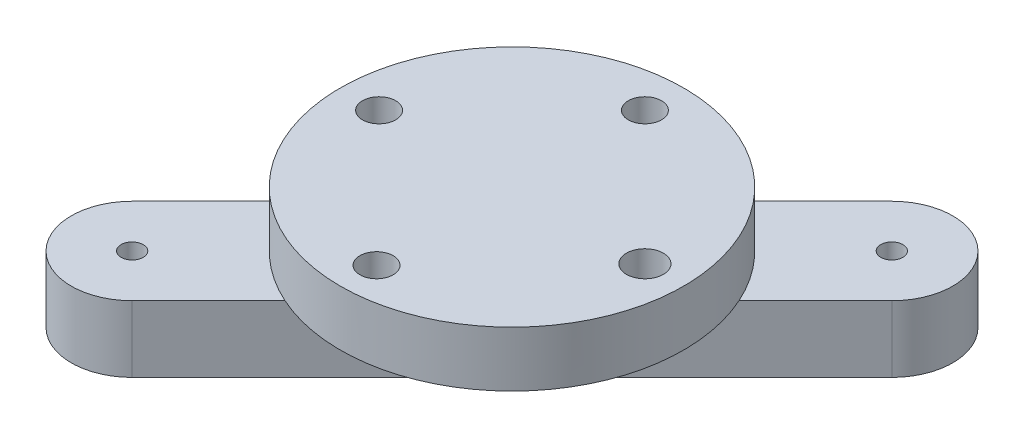
ISO-10303-21;
HEADER;
FILE_DESCRIPTION(('STEP AP214'),'2;1');
FILE_NAME('part.step','',(''),(''),'','','');
FILE_SCHEMA(('AUTOMOTIVE_DESIGN { 1 0 10303 214 1 1 1 1 }'));
ENDSEC;
DATA;
#1=APPLICATION_CONTEXT('core data for automotive mechanical design processes');
#2=APPLICATION_PROTOCOL_DEFINITION('international standard','automotive_design',2000,#1);
#3=PRODUCT_CONTEXT('',#1,'mechanical');
#4=PRODUCT('Part','Part','',(#3));
#5=PRODUCT_RELATED_PRODUCT_CATEGORY('part','',(#4));
#6=PRODUCT_DEFINITION_FORMATION('','',#4);
#7=PRODUCT_DEFINITION_CONTEXT('part definition',#1,'design');
#8=PRODUCT_DEFINITION('design','',#6,#7);
#9=PRODUCT_DEFINITION_SHAPE('','',#8);
#10=(LENGTH_UNIT() NAMED_UNIT(*) SI_UNIT(.MILLI.,.METRE.));
#11=(NAMED_UNIT(*) PLANE_ANGLE_UNIT() SI_UNIT($,.RADIAN.));
#12=(NAMED_UNIT(*) SI_UNIT($,.STERADIAN.) SOLID_ANGLE_UNIT());
#13=UNCERTAINTY_MEASURE_WITH_UNIT(LENGTH_MEASURE(1.E-05),#10,'distance_accuracy_value','');
#14=(GEOMETRIC_REPRESENTATION_CONTEXT(3) GLOBAL_UNCERTAINTY_ASSIGNED_CONTEXT((#13)) GLOBAL_UNIT_ASSIGNED_CONTEXT((#10,
#11,#12)) REPRESENTATION_CONTEXT('',''));
#15=CARTESIAN_POINT('',(0.,0.,0.));
#16=DIRECTION('',(0.,0.,1.));
#17=DIRECTION('',(1.,0.,0.));
#18=AXIS2_PLACEMENT_3D('',#15,#16,#17);
#19=CARTESIAN_POINT('',(0.,0.,0.));
#20=DIRECTION('',(0.,1.,0.));
#21=DIRECTION('',(0.,0.,1.));
#22=AXIS2_PLACEMENT_3D('',#19,#20,#21);
#23=PLANE('',#22);
#24=CARTESIAN_POINT('',(0.,0.,24.));
#25=DIRECTION('',(0.,1.,0.));
#26=DIRECTION('',(0.,0.,1.));
#27=AXIS2_PLACEMENT_3D('',#24,#25,#26);
#28=CIRCLE('',#27,5.);
#29=CARTESIAN_POINT('',(0.,0.,29.));
#30=VERTEX_POINT('',#29);
#31=EDGE_CURVE('E192',#30,#30,#28,.T.);
#32=ORIENTED_EDGE('',*,*,#31,.T.);
#33=EDGE_LOOP('',(#32));
#34=FACE_BOUND('',#33,.T.);
#35=CARTESIAN_POINT('',(24.,0.,0.));
#36=DIRECTION('',(0.,1.,0.));
#37=DIRECTION('',(0.,0.,1.));
#38=AXIS2_PLACEMENT_3D('',#35,#36,#37);
#39=CIRCLE('',#38,5.);
#40=CARTESIAN_POINT('',(24.,0.,5.));
#41=VERTEX_POINT('',#40);
#42=EDGE_CURVE('E184',#41,#41,#39,.T.);
#43=ORIENTED_EDGE('',*,*,#42,.T.);
#44=EDGE_LOOP('',(#43));
#45=FACE_BOUND('',#44,.T.);
#46=CARTESIAN_POINT('',(0.,0.,0.));
#47=DIRECTION('',(0.,1.,0.));
#48=DIRECTION('',(0.,0.,1.));
#49=AXIS2_PLACEMENT_3D('',#46,#47,#48);
#50=CIRCLE('',#49,31.);
#51=CARTESIAN_POINT('',(-12.7157269388672,0.,28.2720761249712));
#52=VERTEX_POINT('',#51);
#53=CARTESIAN_POINT('',(28.2720761249712,0.,-12.7157269388672));
#54=VERTEX_POINT('',#53);
#55=EDGE_CURVE('E204',#52,#54,#50,.T.);
#56=ORIENTED_EDGE('',*,*,#55,.F.);
#57=DIRECTION('',(0.707106781186547,0.,-0.707106781186548));
#58=VECTOR('',#57,1.);
#59=CARTESIAN_POINT('',(-26.5165042944955,0.,42.0728534805996));
#60=LINE('',#59,#58);
#61=EDGE_CURVE('E11',#52,#54,#60,.T.);
#62=ORIENTED_EDGE('',*,*,#61,.T.);
#63=EDGE_LOOP('',(#56,#62));
#64=FACE_BOUND('',#63,.T.);
#65=ADVANCED_FACE('F45',(#34,#45,#64),#23,.F.);
#66=CARTESIAN_POINT('',(0.,10.,0.));
#67=DIRECTION('',(0.,-1.,0.));
#68=DIRECTION('',(0.,0.,-1.));
#69=AXIS2_PLACEMENT_3D('',#66,#67,#68);
#70=CYLINDRICAL_SURFACE('',#69,31.);
#71=CARTESIAN_POINT('',(0.,10.,0.));
#72=DIRECTION('',(0.,1.,0.));
#73=DIRECTION('',(0.,0.,1.));
#74=AXIS2_PLACEMENT_3D('',#71,#72,#73);
#75=CIRCLE('',#74,31.);
#76=CARTESIAN_POINT('',(0.,10.,31.));
#77=VERTEX_POINT('',#76);
#78=EDGE_CURVE('E208',#77,#77,#75,.T.);
#79=ORIENTED_EDGE('',*,*,#78,.F.);
#80=EDGE_LOOP('',(#79));
#81=FACE_BOUND('',#80,.T.);
#82=CARTESIAN_POINT('',(12.7157269388672,0.,-28.2720761249712));
#83=VERTEX_POINT('',#82);
#84=EDGE_CURVE('E212',#54,#83,#50,.T.);
#85=ORIENTED_EDGE('',*,*,#84,.T.);
#86=CARTESIAN_POINT('',(-28.2720761249712,0.,12.7157269388672));
#87=VERTEX_POINT('',#86);
#88=EDGE_CURVE('E216',#83,#87,#50,.T.);
#89=ORIENTED_EDGE('',*,*,#88,.T.);
#90=EDGE_CURVE('E257',#87,#52,#50,.T.);
#91=ORIENTED_EDGE('',*,*,#90,.T.);
#92=ORIENTED_EDGE('',*,*,#55,.T.);
#93=EDGE_LOOP('',(#85,#89,#91,#92));
#94=FACE_BOUND('',#93,.T.);
#95=ADVANCED_FACE('F47',(#81,#94),#70,.T.);
#96=CARTESIAN_POINT('',(0.,10.,0.));
#97=DIRECTION('',(0.,1.,0.));
#98=DIRECTION('',(0.,0.,1.));
#99=AXIS2_PLACEMENT_3D('',#96,#97,#98);
#100=PLANE('',#99);
#101=CARTESIAN_POINT('',(0.,10.,24.4602652919777));
#102=DIRECTION('',(0.,1.,0.));
#103=DIRECTION('',(0.,0.,1.));
#104=AXIS2_PLACEMENT_3D('',#101,#102,#103);
#105=CIRCLE('',#104,3.);
#106=CARTESIAN_POINT('',(0.,10.,27.4602652919777));
#107=VERTEX_POINT('',#106);
#108=EDGE_CURVE('E159',#107,#107,#105,.T.);
#109=ORIENTED_EDGE('',*,*,#108,.F.);
#110=EDGE_LOOP('',(#109));
#111=FACE_BOUND('',#110,.T.);
#112=CARTESIAN_POINT('',(-24.,10.,0.));
#113=DIRECTION('',(0.,1.,0.));
#114=DIRECTION('',(0.,0.,1.));
#115=AXIS2_PLACEMENT_3D('',#112,#113,#114);
#116=CIRCLE('',#115,3.);
#117=CARTESIAN_POINT('',(-24.,10.,3.));
#118=VERTEX_POINT('',#117);
#119=EDGE_CURVE('E164',#118,#118,#116,.T.);
#120=ORIENTED_EDGE('',*,*,#119,.F.);
#121=EDGE_LOOP('',(#120));
#122=FACE_BOUND('',#121,.T.);
#123=CARTESIAN_POINT('',(24.,10.,0.));
#124=DIRECTION('',(0.,1.,0.));
#125=DIRECTION('',(0.,0.,1.));
#126=AXIS2_PLACEMENT_3D('',#123,#124,#125);
#127=CIRCLE('',#126,3.32964799338653);
#128=CARTESIAN_POINT('',(24.,10.,3.32964799338653));
#129=VERTEX_POINT('',#128);
#130=EDGE_CURVE('E168',#129,#129,#127,.T.);
#131=ORIENTED_EDGE('',*,*,#130,.F.);
#132=EDGE_LOOP('',(#131));
#133=FACE_BOUND('',#132,.T.);
#134=CARTESIAN_POINT('',(0.,10.,-24.));
#135=DIRECTION('',(0.,1.,0.));
#136=DIRECTION('',(0.,0.,1.));
#137=AXIS2_PLACEMENT_3D('',#134,#135,#136);
#138=CIRCLE('',#137,3.);
#139=CARTESIAN_POINT('',(0.,10.,-21.));
#140=VERTEX_POINT('',#139);
#141=EDGE_CURVE('E153',#140,#140,#138,.T.);
#142=ORIENTED_EDGE('',*,*,#141,.F.);
#143=EDGE_LOOP('',(#142));
#144=FACE_BOUND('',#143,.T.);
#145=ORIENTED_EDGE('',*,*,#78,.T.);
#146=EDGE_LOOP('',(#145));
#147=FACE_BOUND('',#146,.T.);
#148=ADVANCED_FACE('F250',(#111,#122,#133,#144,#147),#100,.T.);
#149=CARTESIAN_POINT('',(-24.,0.,0.));
#150=DIRECTION('',(0.,1.,0.));
#151=DIRECTION('',(0.,0.,1.));
#152=AXIS2_PLACEMENT_3D('',#149,#150,#151);
#153=CIRCLE('',#152,5.);
#154=CARTESIAN_POINT('',(-24.,0.,5.));
#155=VERTEX_POINT('',#154);
#156=EDGE_CURVE('E180',#155,#155,#153,.T.);
#157=ORIENTED_EDGE('',*,*,#156,.T.);
#158=EDGE_LOOP('',(#157));
#159=FACE_BOUND('',#158,.T.);
#160=CARTESIAN_POINT('',(0.,0.,-24.));
#161=DIRECTION('',(0.,1.,0.));
#162=DIRECTION('',(0.,0.,1.));
#163=AXIS2_PLACEMENT_3D('',#160,#161,#162);
#164=CIRCLE('',#163,5.);
#165=CARTESIAN_POINT('',(0.,0.,-19.));
#166=VERTEX_POINT('',#165);
#167=EDGE_CURVE('E179',#166,#166,#164,.T.);
#168=ORIENTED_EDGE('',*,*,#167,.T.);
#169=EDGE_LOOP('',(#168));
#170=FACE_BOUND('',#169,.T.);
#171=ORIENTED_EDGE('',*,*,#88,.F.);
#172=DIRECTION('',(-0.707106781186547,0.,0.707106781186548));
#173=VECTOR('',#172,1.);
#174=CARTESIAN_POINT('',(-42.0728534805996,0.,26.5165042944955));
#175=LINE('',#174,#173);
#176=EDGE_CURVE('E55',#83,#87,#175,.T.);
#177=ORIENTED_EDGE('',*,*,#176,.T.);
#178=EDGE_LOOP('',(#171,#177));
#179=FACE_BOUND('',#178,.T.);
#180=ADVANCED_FACE('F244',(#159,#170,#179),#23,.F.);
#181=CARTESIAN_POINT('',(0.,4.,-24.));
#182=DIRECTION('',(0.,-1.,0.));
#183=DIRECTION('',(0.,0.,-1.));
#184=AXIS2_PLACEMENT_3D('',#181,#182,#183);
#185=CYLINDRICAL_SURFACE('',#184,5.);
#186=CARTESIAN_POINT('',(0.,4.,-24.));
#187=DIRECTION('',(0.,1.,0.));
#188=DIRECTION('',(0.,0.,1.));
#189=AXIS2_PLACEMENT_3D('',#186,#187,#188);
#190=CIRCLE('',#189,5.);
#191=CARTESIAN_POINT('',(0.,4.,-19.));
#192=VERTEX_POINT('',#191);
#193=EDGE_CURVE('E200',#192,#192,#190,.T.);
#194=ORIENTED_EDGE('',*,*,#193,.T.);
#195=EDGE_LOOP('',(#194));
#196=FACE_BOUND('',#195,.T.);
#197=ORIENTED_EDGE('',*,*,#167,.F.);
#198=EDGE_LOOP('',(#197));
#199=FACE_BOUND('',#198,.T.);
#200=ADVANCED_FACE('F238',(#196,#199),#185,.F.);
#201=CARTESIAN_POINT('',(0.,4.,-24.));
#202=DIRECTION('',(0.,1.,0.));
#203=DIRECTION('',(0.,0.,1.));
#204=AXIS2_PLACEMENT_3D('',#201,#202,#203);
#205=PLANE('',#204);
#206=CARTESIAN_POINT('',(0.,4.,-24.));
#207=DIRECTION('',(0.,1.,0.));
#208=DIRECTION('',(0.,0.,1.));
#209=AXIS2_PLACEMENT_3D('',#206,#207,#208);
#210=CIRCLE('',#209,3.);
#211=CARTESIAN_POINT('',(0.,4.,-21.));
#212=VERTEX_POINT('',#211);
#213=EDGE_CURVE('E49',#212,#212,#210,.F.);
#214=ORIENTED_EDGE('',*,*,#213,.F.);
#215=EDGE_LOOP('',(#214));
#216=FACE_BOUND('',#215,.T.);
#217=ORIENTED_EDGE('',*,*,#193,.F.);
#218=EDGE_LOOP('',(#217));
#219=FACE_BOUND('',#218,.T.);
#220=ADVANCED_FACE('F234',(#216,#219),#205,.F.);
#221=CARTESIAN_POINT('',(0.,4.,24.));
#222=DIRECTION('',(0.,-1.,0.));
#223=DIRECTION('',(0.,0.,-1.));
#224=AXIS2_PLACEMENT_3D('',#221,#222,#223);
#225=CYLINDRICAL_SURFACE('',#224,5.);
#226=CARTESIAN_POINT('',(0.,4.,24.));
#227=DIRECTION('',(0.,1.,0.));
#228=DIRECTION('',(0.,0.,1.));
#229=AXIS2_PLACEMENT_3D('',#226,#227,#228);
#230=CIRCLE('',#229,5.);
#231=CARTESIAN_POINT('',(0.,4.,29.));
#232=VERTEX_POINT('',#231);
#233=EDGE_CURVE('E196',#232,#232,#230,.T.);
#234=ORIENTED_EDGE('',*,*,#233,.T.);
#235=EDGE_LOOP('',(#234));
#236=FACE_BOUND('',#235,.T.);
#237=ORIENTED_EDGE('',*,*,#31,.F.);
#238=EDGE_LOOP('',(#237));
#239=FACE_BOUND('',#238,.T.);
#240=ADVANCED_FACE('F237',(#236,#239),#225,.F.);
#241=CARTESIAN_POINT('',(0.,4.,24.));
#242=DIRECTION('',(0.,1.,0.));
#243=DIRECTION('',(0.,0.,1.));
#244=AXIS2_PLACEMENT_3D('',#241,#242,#243);
#245=PLANE('',#244);
#246=CARTESIAN_POINT('',(0.,4.,24.4602652919777));
#247=DIRECTION('',(0.,1.,0.));
#248=DIRECTION('',(0.,0.,1.));
#249=AXIS2_PLACEMENT_3D('',#246,#247,#248);
#250=CIRCLE('',#249,3.);
#251=CARTESIAN_POINT('',(0.,4.,27.4602652919777));
#252=VERTEX_POINT('',#251);
#253=EDGE_CURVE('E223',#252,#252,#250,.F.);
#254=ORIENTED_EDGE('',*,*,#253,.F.);
#255=EDGE_LOOP('',(#254));
#256=FACE_BOUND('',#255,.T.);
#257=ORIENTED_EDGE('',*,*,#233,.F.);
#258=EDGE_LOOP('',(#257));
#259=FACE_BOUND('',#258,.T.);
#260=ADVANCED_FACE('F295',(#256,#259),#245,.F.);
#261=CARTESIAN_POINT('',(24.,4.,0.));
#262=DIRECTION('',(0.,-1.,0.));
#263=DIRECTION('',(0.,0.,-1.));
#264=AXIS2_PLACEMENT_3D('',#261,#262,#263);
#265=CYLINDRICAL_SURFACE('',#264,5.);
#266=CARTESIAN_POINT('',(24.,4.,0.));
#267=DIRECTION('',(0.,1.,0.));
#268=DIRECTION('',(0.,0.,1.));
#269=AXIS2_PLACEMENT_3D('',#266,#267,#268);
#270=CIRCLE('',#269,5.);
#271=CARTESIAN_POINT('',(24.,4.,5.));
#272=VERTEX_POINT('',#271);
#273=EDGE_CURVE('E188',#272,#272,#270,.T.);
#274=ORIENTED_EDGE('',*,*,#273,.T.);
#275=EDGE_LOOP('',(#274));
#276=FACE_BOUND('',#275,.T.);
#277=ORIENTED_EDGE('',*,*,#42,.F.);
#278=EDGE_LOOP('',(#277));
#279=FACE_BOUND('',#278,.T.);
#280=ADVANCED_FACE('F298',(#276,#279),#265,.F.);
#281=CARTESIAN_POINT('',(24.,4.,0.));
#282=DIRECTION('',(0.,1.,0.));
#283=DIRECTION('',(0.,0.,1.));
#284=AXIS2_PLACEMENT_3D('',#281,#282,#283);
#285=PLANE('',#284);
#286=CARTESIAN_POINT('',(24.,4.,0.));
#287=DIRECTION('',(0.,1.,0.));
#288=DIRECTION('',(0.,0.,1.));
#289=AXIS2_PLACEMENT_3D('',#286,#287,#288);
#290=CIRCLE('',#289,3.32964799338653);
#291=CARTESIAN_POINT('',(24.,4.,3.32964799338653));
#292=VERTEX_POINT('',#291);
#293=EDGE_CURVE('E220',#292,#292,#290,.F.);
#294=ORIENTED_EDGE('',*,*,#293,.F.);
#295=EDGE_LOOP('',(#294));
#296=FACE_BOUND('',#295,.T.);
#297=ORIENTED_EDGE('',*,*,#273,.F.);
#298=EDGE_LOOP('',(#297));
#299=FACE_BOUND('',#298,.T.);
#300=ADVANCED_FACE('F303',(#296,#299),#285,.F.);
#301=CARTESIAN_POINT('',(-24.,4.,0.));
#302=DIRECTION('',(0.,-1.,0.));
#303=DIRECTION('',(0.,0.,-1.));
#304=AXIS2_PLACEMENT_3D('',#301,#302,#303);
#305=CYLINDRICAL_SURFACE('',#304,5.);
#306=CARTESIAN_POINT('',(-24.,4.,0.));
#307=DIRECTION('',(0.,1.,0.));
#308=DIRECTION('',(0.,0.,1.));
#309=AXIS2_PLACEMENT_3D('',#306,#307,#308);
#310=CIRCLE('',#309,5.);
#311=CARTESIAN_POINT('',(-24.,4.,5.));
#312=VERTEX_POINT('',#311);
#313=EDGE_CURVE('E175',#312,#312,#310,.T.);
#314=ORIENTED_EDGE('',*,*,#313,.T.);
#315=EDGE_LOOP('',(#314));
#316=FACE_BOUND('',#315,.T.);
#317=ORIENTED_EDGE('',*,*,#156,.F.);
#318=EDGE_LOOP('',(#317));
#319=FACE_BOUND('',#318,.T.);
#320=ADVANCED_FACE('F306',(#316,#319),#305,.F.);
#321=CARTESIAN_POINT('',(-24.,4.,0.));
#322=DIRECTION('',(0.,1.,0.));
#323=DIRECTION('',(0.,0.,1.));
#324=AXIS2_PLACEMENT_3D('',#321,#322,#323);
#325=PLANE('',#324);
#326=CARTESIAN_POINT('',(-24.,4.,0.));
#327=DIRECTION('',(0.,1.,0.));
#328=DIRECTION('',(0.,0.,1.));
#329=AXIS2_PLACEMENT_3D('',#326,#327,#328);
#330=CIRCLE('',#329,3.);
#331=CARTESIAN_POINT('',(-24.,4.,3.));
#332=VERTEX_POINT('',#331);
#333=EDGE_CURVE('E163',#332,#332,#330,.F.);
#334=ORIENTED_EDGE('',*,*,#333,.F.);
#335=EDGE_LOOP('',(#334));
#336=FACE_BOUND('',#335,.T.);
#337=ORIENTED_EDGE('',*,*,#313,.F.);
#338=EDGE_LOOP('',(#337));
#339=FACE_BOUND('',#338,.T.);
#340=ADVANCED_FACE('F313',(#336,#339),#325,.F.);
#341=CARTESIAN_POINT('',(-24.,10.,0.));
#342=DIRECTION('',(0.,-1.,0.));
#343=DIRECTION('',(0.,0.,-1.));
#344=AXIS2_PLACEMENT_3D('',#341,#342,#343);
#345=CYLINDRICAL_SURFACE('',#344,3.);
#346=ORIENTED_EDGE('',*,*,#119,.T.);
#347=EDGE_LOOP('',(#346));
#348=FACE_BOUND('',#347,.T.);
#349=ORIENTED_EDGE('',*,*,#333,.T.);
#350=EDGE_LOOP('',(#349));
#351=FACE_BOUND('',#350,.T.);
#352=ADVANCED_FACE('F317',(#348,#351),#345,.F.);
#353=CARTESIAN_POINT('',(24.,10.,0.));
#354=DIRECTION('',(0.,-1.,0.));
#355=DIRECTION('',(0.,0.,-1.));
#356=AXIS2_PLACEMENT_3D('',#353,#354,#355);
#357=CYLINDRICAL_SURFACE('',#356,3.32964799338653);
#358=ORIENTED_EDGE('',*,*,#130,.T.);
#359=EDGE_LOOP('',(#358));
#360=FACE_BOUND('',#359,.T.);
#361=ORIENTED_EDGE('',*,*,#293,.T.);
#362=EDGE_LOOP('',(#361));
#363=FACE_BOUND('',#362,.T.);
#364=ADVANCED_FACE('F322',(#360,#363),#357,.F.);
#365=CARTESIAN_POINT('',(0.,10.,24.4602652919777));
#366=DIRECTION('',(0.,-1.,0.));
#367=DIRECTION('',(0.,0.,-1.));
#368=AXIS2_PLACEMENT_3D('',#365,#366,#367);
#369=CYLINDRICAL_SURFACE('',#368,3.);
#370=ORIENTED_EDGE('',*,*,#108,.T.);
#371=EDGE_LOOP('',(#370));
#372=FACE_BOUND('',#371,.T.);
#373=ORIENTED_EDGE('',*,*,#253,.T.);
#374=EDGE_LOOP('',(#373));
#375=FACE_BOUND('',#374,.T.);
#376=ADVANCED_FACE('F320',(#372,#375),#369,.F.);
#377=CARTESIAN_POINT('',(0.,10.,-24.));
#378=DIRECTION('',(0.,-1.,0.));
#379=DIRECTION('',(0.,0.,-1.));
#380=AXIS2_PLACEMENT_3D('',#377,#378,#379);
#381=CYLINDRICAL_SURFACE('',#380,3.);
#382=ORIENTED_EDGE('',*,*,#141,.T.);
#383=EDGE_LOOP('',(#382));
#384=FACE_BOUND('',#383,.T.);
#385=ORIENTED_EDGE('',*,*,#213,.T.);
#386=EDGE_LOOP('',(#385));
#387=FACE_BOUND('',#386,.T.);
#388=ADVANCED_FACE('F232',(#384,#387),#381,.F.);
#389=CARTESIAN_POINT('',(-34.2946788875476,0.,34.2946788875476));
#390=DIRECTION('',(0.,1.,0.));
#391=DIRECTION('',(0.,0.,1.));
#392=AXIS2_PLACEMENT_3D('',#389,#390,#391);
#393=PLANE('',#392);
#394=CARTESIAN_POINT('',(34.2946788875475,0.,-34.2946788875476));
#395=DIRECTION('',(0.,1.,0.));
#396=DIRECTION('',(0.,0.,1.));
#397=AXIS2_PLACEMENT_3D('',#394,#395,#396);
#398=CIRCLE('',#397,2.);
#399=CARTESIAN_POINT('',(34.2946788875475,0.,-32.2946788875475));
#400=VERTEX_POINT('',#399);
#401=EDGE_CURVE('E135',#400,#400,#398,.T.);
#402=ORIENTED_EDGE('',*,*,#401,.F.);
#403=EDGE_LOOP('',(#402));
#404=FACE_BOUND('',#403,.T.);
#405=ORIENTED_EDGE('',*,*,#84,.F.);
#406=CARTESIAN_POINT('',(42.0728534805995,0.,-26.5165042944955));
#407=VERTEX_POINT('',#406);
#408=EDGE_CURVE('E58',#54,#407,#60,.T.);
#409=ORIENTED_EDGE('',*,*,#408,.T.);
#410=CARTESIAN_POINT('',(34.2946788875475,0.,-34.2946788875476));
#411=DIRECTION('',(0.,1.,0.));
#412=DIRECTION('',(0.,0.,1.));
#413=AXIS2_PLACEMENT_3D('',#410,#411,#412);
#414=CIRCLE('',#413,11.);
#415=CARTESIAN_POINT('',(26.5165042944955,0.,-42.0728534805996));
#416=VERTEX_POINT('',#415);
#417=EDGE_CURVE('E147',#407,#416,#414,.T.);
#418=ORIENTED_EDGE('',*,*,#417,.T.);
#419=EDGE_CURVE('E130',#416,#83,#175,.T.);
#420=ORIENTED_EDGE('',*,*,#419,.T.);
#421=EDGE_LOOP('',(#405,#409,#418,#420));
#422=FACE_BOUND('',#421,.T.);
#423=ADVANCED_FACE('F262',(#404,#422),#393,.T.);
#424=CARTESIAN_POINT('',(-34.2946788875476,0.,34.2946788875476));
#425=DIRECTION('',(0.,1.,0.));
#426=DIRECTION('',(0.,0.,1.));
#427=AXIS2_PLACEMENT_3D('',#424,#425,#426);
#428=CIRCLE('',#427,2.);
#429=CARTESIAN_POINT('',(-34.2946788875476,0.,36.2946788875476));
#430=VERTEX_POINT('',#429);
#431=EDGE_CURVE('E361',#430,#430,#428,.T.);
#432=ORIENTED_EDGE('',*,*,#431,.F.);
#433=EDGE_LOOP('',(#432));
#434=FACE_BOUND('',#433,.T.);
#435=ORIENTED_EDGE('',*,*,#90,.F.);
#436=CARTESIAN_POINT('',(-42.0728534805996,0.,26.5165042944955));
#437=VERTEX_POINT('',#436);
#438=EDGE_CURVE('E65',#87,#437,#175,.T.);
#439=ORIENTED_EDGE('',*,*,#438,.T.);
#440=CARTESIAN_POINT('',(-34.2946788875476,0.,34.2946788875476));
#441=DIRECTION('',(0.,1.,0.));
#442=DIRECTION('',(0.,0.,1.));
#443=AXIS2_PLACEMENT_3D('',#440,#441,#442);
#444=CIRCLE('',#443,11.);
#445=CARTESIAN_POINT('',(-26.5165042944955,0.,42.0728534805996));
#446=VERTEX_POINT('',#445);
#447=EDGE_CURVE('E142',#437,#446,#444,.T.);
#448=ORIENTED_EDGE('',*,*,#447,.T.);
#449=EDGE_CURVE('E57',#446,#52,#60,.T.);
#450=ORIENTED_EDGE('',*,*,#449,.T.);
#451=EDGE_LOOP('',(#435,#439,#448,#450));
#452=FACE_BOUND('',#451,.T.);
#453=ADVANCED_FACE('F271',(#434,#452),#393,.T.);
#454=CARTESIAN_POINT('',(-34.2946788875476,-12.,34.2946788875476));
#455=DIRECTION('',(0.,1.,0.));
#456=DIRECTION('',(0.,0.,1.));
#457=AXIS2_PLACEMENT_3D('',#454,#455,#456);
#458=CYLINDRICAL_SURFACE('',#457,11.);
#459=ORIENTED_EDGE('',*,*,#447,.F.);
#460=DIRECTION('',(0.,1.,0.));
#461=VECTOR('',#460,1.);
#462=CARTESIAN_POINT('',(-42.0728534805996,-12.,26.5165042944955));
#463=LINE('',#462,#461);
#464=CARTESIAN_POINT('',(-42.0728534805996,-12.,26.5165042944955));
#465=VERTEX_POINT('',#464);
#466=EDGE_CURVE('E128',#465,#437,#463,.T.);
#467=ORIENTED_EDGE('',*,*,#466,.F.);
#468=CARTESIAN_POINT('',(-34.2946788875476,-12.,34.2946788875476));
#469=DIRECTION('',(0.,1.,0.));
#470=DIRECTION('',(0.,0.,1.));
#471=AXIS2_PLACEMENT_3D('',#468,#469,#470);
#472=CIRCLE('',#471,11.);
#473=CARTESIAN_POINT('',(-26.5165042944955,-12.,42.0728534805996));
#474=VERTEX_POINT('',#473);
#475=EDGE_CURVE('E121',#465,#474,#472,.T.);
#476=ORIENTED_EDGE('',*,*,#475,.T.);
#477=DIRECTION('',(0.,1.,0.));
#478=VECTOR('',#477,1.);
#479=CARTESIAN_POINT('',(-26.5165042944955,-12.,42.0728534805996));
#480=LINE('',#479,#478);
#481=EDGE_CURVE('E102',#474,#446,#480,.T.);
#482=ORIENTED_EDGE('',*,*,#481,.T.);
#483=EDGE_LOOP('',(#459,#467,#476,#482));
#484=FACE_BOUND('',#483,.T.);
#485=ADVANCED_FACE('F127',(#484),#458,.T.);
#486=CARTESIAN_POINT('',(-42.0728534805996,-12.,26.5165042944955));
#487=DIRECTION('',(-0.707106781186548,0.,-0.707106781186547));
#488=DIRECTION('',(-0.707106781186547,0.,0.707106781186548));
#489=AXIS2_PLACEMENT_3D('',#486,#487,#488);
#490=PLANE('',#489);
#491=ORIENTED_EDGE('',*,*,#419,.F.);
#492=DIRECTION('',(0.,1.,0.));
#493=VECTOR('',#492,1.);
#494=CARTESIAN_POINT('',(26.5165042944955,-12.,-42.0728534805996));
#495=LINE('',#494,#493);
#496=CARTESIAN_POINT('',(26.5165042944955,-12.,-42.0728534805996));
#497=VERTEX_POINT('',#496);
#498=EDGE_CURVE('E154',#497,#416,#495,.T.);
#499=ORIENTED_EDGE('',*,*,#498,.F.);
#500=DIRECTION('',(-0.707106781186547,0.,0.707106781186548));
#501=VECTOR('',#500,1.);
#502=CARTESIAN_POINT('',(-42.0728534805996,-12.,26.5165042944955));
#503=LINE('',#502,#501);
#504=EDGE_CURVE('E114',#497,#465,#503,.T.);
#505=ORIENTED_EDGE('',*,*,#504,.T.);
#506=ORIENTED_EDGE('',*,*,#466,.T.);
#507=ORIENTED_EDGE('',*,*,#438,.F.);
#508=ORIENTED_EDGE('',*,*,#176,.F.);
#509=EDGE_LOOP('',(#491,#499,#505,#506,#507,#508));
#510=FACE_BOUND('',#509,.T.);
#511=ADVANCED_FACE('F272',(#510),#490,.T.);
#512=CARTESIAN_POINT('',(34.2946788875475,-12.,-34.2946788875476));
#513=DIRECTION('',(0.,1.,0.));
#514=DIRECTION('',(0.,0.,1.));
#515=AXIS2_PLACEMENT_3D('',#512,#513,#514);
#516=CYLINDRICAL_SURFACE('',#515,11.);
#517=ORIENTED_EDGE('',*,*,#417,.F.);
#518=DIRECTION('',(0.,1.,0.));
#519=VECTOR('',#518,1.);
#520=CARTESIAN_POINT('',(42.0728534805995,-12.,-26.5165042944955));
#521=LINE('',#520,#519);
#522=CARTESIAN_POINT('',(42.0728534805995,-12.,-26.5165042944955));
#523=VERTEX_POINT('',#522);
#524=EDGE_CURVE('E113',#523,#407,#521,.T.);
#525=ORIENTED_EDGE('',*,*,#524,.F.);
#526=CARTESIAN_POINT('',(34.2946788875475,-12.,-34.2946788875476));
#527=DIRECTION('',(0.,1.,0.));
#528=DIRECTION('',(0.,0.,1.));
#529=AXIS2_PLACEMENT_3D('',#526,#527,#528);
#530=CIRCLE('',#529,11.);
#531=EDGE_CURVE('E124',#523,#497,#530,.T.);
#532=ORIENTED_EDGE('',*,*,#531,.T.);
#533=ORIENTED_EDGE('',*,*,#498,.T.);
#534=EDGE_LOOP('',(#517,#525,#532,#533));
#535=FACE_BOUND('',#534,.T.);
#536=ADVANCED_FACE('F274',(#535),#516,.T.);
#537=CARTESIAN_POINT('',(-26.5165042944955,-12.,42.0728534805996));
#538=DIRECTION('',(0.707106781186548,0.,0.707106781186547));
#539=DIRECTION('',(0.707106781186547,0.,-0.707106781186548));
#540=AXIS2_PLACEMENT_3D('',#537,#538,#539);
#541=PLANE('',#540);
#542=ORIENTED_EDGE('',*,*,#449,.F.);
#543=ORIENTED_EDGE('',*,*,#481,.F.);
#544=DIRECTION('',(0.707106781186547,0.,-0.707106781186548));
#545=VECTOR('',#544,1.);
#546=CARTESIAN_POINT('',(-26.5165042944955,-12.,42.0728534805996));
#547=LINE('',#546,#545);
#548=EDGE_CURVE('E106',#474,#523,#547,.T.);
#549=ORIENTED_EDGE('',*,*,#548,.T.);
#550=ORIENTED_EDGE('',*,*,#524,.T.);
#551=ORIENTED_EDGE('',*,*,#408,.F.);
#552=ORIENTED_EDGE('',*,*,#61,.F.);
#553=EDGE_LOOP('',(#542,#543,#549,#550,#551,#552));
#554=FACE_BOUND('',#553,.T.);
#555=ADVANCED_FACE('F104',(#554),#541,.T.);
#556=CARTESIAN_POINT('',(-34.2946788875476,-12.,34.2946788875476));
#557=DIRECTION('',(0.,1.,0.));
#558=DIRECTION('',(0.,0.,1.));
#559=AXIS2_PLACEMENT_3D('',#556,#557,#558);
#560=PLANE('',#559);
#561=CARTESIAN_POINT('',(-34.2946788875476,-12.,34.2946788875476));
#562=DIRECTION('',(0.,1.,0.));
#563=DIRECTION('',(0.,0.,1.));
#564=AXIS2_PLACEMENT_3D('',#561,#562,#563);
#565=CIRCLE('',#564,2.);
#566=CARTESIAN_POINT('',(-34.2946788875476,-12.,36.2946788875476));
#567=VERTEX_POINT('',#566);
#568=EDGE_CURVE('E359',#567,#567,#565,.T.);
#569=ORIENTED_EDGE('',*,*,#568,.T.);
#570=EDGE_LOOP('',(#569));
#571=FACE_BOUND('',#570,.T.);
#572=CARTESIAN_POINT('',(34.2946788875475,-12.,-34.2946788875476));
#573=DIRECTION('',(0.,1.,0.));
#574=DIRECTION('',(0.,0.,1.));
#575=AXIS2_PLACEMENT_3D('',#572,#573,#574);
#576=CIRCLE('',#575,2.);
#577=CARTESIAN_POINT('',(34.2946788875475,-12.,-32.2946788875475));
#578=VERTEX_POINT('',#577);
#579=EDGE_CURVE('E144',#578,#578,#576,.T.);
#580=ORIENTED_EDGE('',*,*,#579,.T.);
#581=EDGE_LOOP('',(#580));
#582=FACE_BOUND('',#581,.T.);
#583=ORIENTED_EDGE('',*,*,#475,.F.);
#584=ORIENTED_EDGE('',*,*,#504,.F.);
#585=ORIENTED_EDGE('',*,*,#531,.F.);
#586=ORIENTED_EDGE('',*,*,#548,.F.);
#587=EDGE_LOOP('',(#583,#584,#585,#586));
#588=FACE_BOUND('',#587,.T.);
#589=ADVANCED_FACE('F119',(#571,#582,#588),#560,.F.);
#590=CARTESIAN_POINT('',(34.2946788875475,-12.,-34.2946788875476));
#591=DIRECTION('',(0.,1.,0.));
#592=DIRECTION('',(0.,0.,1.));
#593=AXIS2_PLACEMENT_3D('',#590,#591,#592);
#594=CYLINDRICAL_SURFACE('',#593,2.);
#595=ORIENTED_EDGE('',*,*,#579,.F.);
#596=EDGE_LOOP('',(#595));
#597=FACE_BOUND('',#596,.T.);
#598=ORIENTED_EDGE('',*,*,#401,.T.);
#599=EDGE_LOOP('',(#598));
#600=FACE_BOUND('',#599,.T.);
#601=ADVANCED_FACE('F346',(#597,#600),#594,.F.);
#602=CARTESIAN_POINT('',(-34.2946788875476,-12.,34.2946788875476));
#603=DIRECTION('',(0.,1.,0.));
#604=DIRECTION('',(0.,0.,1.));
#605=AXIS2_PLACEMENT_3D('',#602,#603,#604);
#606=CYLINDRICAL_SURFACE('',#605,2.);
#607=ORIENTED_EDGE('',*,*,#568,.F.);
#608=EDGE_LOOP('',(#607));
#609=FACE_BOUND('',#608,.T.);
#610=ORIENTED_EDGE('',*,*,#431,.T.);
#611=EDGE_LOOP('',(#610));
#612=FACE_BOUND('',#611,.T.);
#613=ADVANCED_FACE('F350',(#609,#612),#606,.F.);
#614=CLOSED_SHELL('',(#65,#95,#148,#180,#200,#220,#240,#260,#280,#300,#320,#340,#352,#364,#376,
#388,#423,#453,#485,#511,#536,#555,#589,#601,#613));
#615=MANIFOLD_SOLID_BREP('B2',#614);
#616=ADVANCED_BREP_SHAPE_REPRESENTATION('',(#18,#615),#14);
#617=SHAPE_DEFINITION_REPRESENTATION(#9,#616);
ENDSEC;
END-ISO-10303-21;
